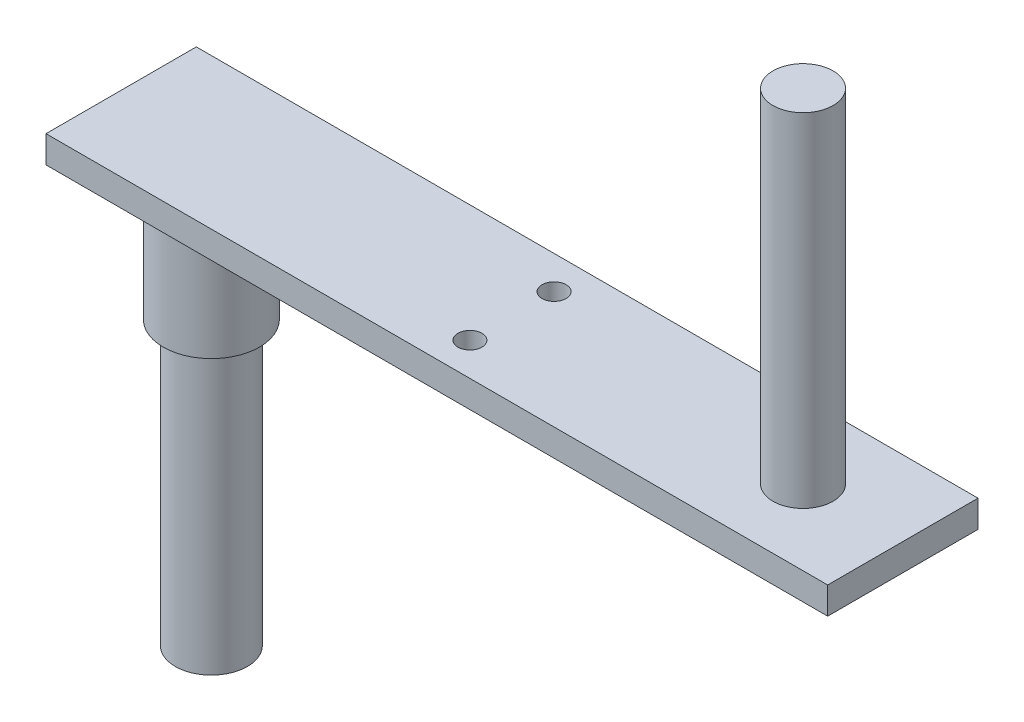
ISO-10303-21;
HEADER;
FILE_DESCRIPTION(('STEP AP214'),'2;1');
FILE_NAME('part.step','',(''),(''),'','','');
FILE_SCHEMA(('AUTOMOTIVE_DESIGN { 1 0 10303 214 1 1 1 1 }'));
ENDSEC;
DATA;
#1=APPLICATION_CONTEXT('core data for automotive mechanical design processes');
#2=APPLICATION_PROTOCOL_DEFINITION('international standard','automotive_design',2000,#1);
#3=PRODUCT_CONTEXT('',#1,'mechanical');
#4=PRODUCT('Part','Part','',(#3));
#5=PRODUCT_RELATED_PRODUCT_CATEGORY('part','',(#4));
#6=PRODUCT_DEFINITION_FORMATION('','',#4);
#7=PRODUCT_DEFINITION_CONTEXT('part definition',#1,'design');
#8=PRODUCT_DEFINITION('design','',#6,#7);
#9=PRODUCT_DEFINITION_SHAPE('','',#8);
#10=(LENGTH_UNIT() NAMED_UNIT(*) SI_UNIT(.MILLI.,.METRE.));
#11=(NAMED_UNIT(*) PLANE_ANGLE_UNIT() SI_UNIT($,.RADIAN.));
#12=(NAMED_UNIT(*) SI_UNIT($,.STERADIAN.) SOLID_ANGLE_UNIT());
#13=UNCERTAINTY_MEASURE_WITH_UNIT(LENGTH_MEASURE(1.E-05),#10,'distance_accuracy_value','');
#14=(GEOMETRIC_REPRESENTATION_CONTEXT(3) GLOBAL_UNCERTAINTY_ASSIGNED_CONTEXT((#13)) GLOBAL_UNIT_ASSIGNED_CONTEXT((#10,
#11,#12)) REPRESENTATION_CONTEXT('',''));
#15=CARTESIAN_POINT('',(0.,0.,0.));
#16=DIRECTION('',(0.,0.,1.));
#17=DIRECTION('',(1.,0.,0.));
#18=AXIS2_PLACEMENT_3D('',#15,#16,#17);
#19=CARTESIAN_POINT('',(65.,4.49999999999995,12.5));
#20=DIRECTION('',(-1.,0.,0.));
#21=DIRECTION('',(0.,0.,0.999999999999999));
#22=AXIS2_PLACEMENT_3D('',#19,#20,#21);
#23=PLANE('',#22);
#24=DIRECTION('',(0.,0.,-0.999999999999999));
#25=VECTOR('',#24,1.);
#26=CARTESIAN_POINT('',(65.,0.,12.5));
#27=LINE('',#26,#25);
#28=CARTESIAN_POINT('',(65.,0.,12.5));
#29=VERTEX_POINT('',#28);
#30=CARTESIAN_POINT('',(65.,0.,-12.5));
#31=VERTEX_POINT('',#30);
#32=EDGE_CURVE('E114',#29,#31,#27,.T.);
#33=ORIENTED_EDGE('',*,*,#32,.T.);
#34=DIRECTION('',(0.,-0.999999999999999,0.));
#35=VECTOR('',#34,1.);
#36=CARTESIAN_POINT('',(65.,4.49999999999995,-12.5));
#37=LINE('',#36,#35);
#38=CARTESIAN_POINT('',(65.,4.49999999999995,-12.5));
#39=VERTEX_POINT('',#38);
#40=EDGE_CURVE('E56',#39,#31,#37,.T.);
#41=ORIENTED_EDGE('',*,*,#40,.F.);
#42=DIRECTION('',(0.,0.,-0.999999999999999));
#43=VECTOR('',#42,1.);
#44=CARTESIAN_POINT('',(65.,4.49999999999995,12.5));
#45=LINE('',#44,#43);
#46=CARTESIAN_POINT('',(65.,4.49999999999995,12.5));
#47=VERTEX_POINT('',#46);
#48=EDGE_CURVE('E100',#47,#39,#45,.T.);
#49=ORIENTED_EDGE('',*,*,#48,.F.);
#50=DIRECTION('',(0.,-0.999999999999999,0.));
#51=VECTOR('',#50,1.);
#52=CARTESIAN_POINT('',(65.,4.49999999999995,12.5));
#53=LINE('',#52,#51);
#54=EDGE_CURVE('E110',#47,#29,#53,.T.);
#55=ORIENTED_EDGE('',*,*,#54,.T.);
#56=EDGE_LOOP('',(#33,#41,#49,#55));
#57=FACE_BOUND('',#56,.T.);
#58=ADVANCED_FACE('F48',(#57),#23,.F.);
#59=CARTESIAN_POINT('',(-65.,4.50000000000006,-12.5));
#60=DIRECTION('',(0.,0.,0.999999999999999));
#61=DIRECTION('',(1.,0.,0.));
#62=AXIS2_PLACEMENT_3D('',#59,#60,#61);
#63=PLANE('',#62);
#64=DIRECTION('',(-1.,0.,0.));
#65=VECTOR('',#64,1.);
#66=CARTESIAN_POINT('',(-65.,0.,-12.5));
#67=LINE('',#66,#65);
#68=CARTESIAN_POINT('',(-65.,0.,-12.5));
#69=VERTEX_POINT('',#68);
#70=EDGE_CURVE('E105',#31,#69,#67,.T.);
#71=ORIENTED_EDGE('',*,*,#70,.T.);
#72=DIRECTION('',(0.,-0.999999999999999,0.));
#73=VECTOR('',#72,1.);
#74=CARTESIAN_POINT('',(-65.,4.50000000000006,-12.5));
#75=LINE('',#74,#73);
#76=CARTESIAN_POINT('',(-65.,4.50000000000006,-12.5));
#77=VERTEX_POINT('',#76);
#78=EDGE_CURVE('E103',#77,#69,#75,.T.);
#79=ORIENTED_EDGE('',*,*,#78,.F.);
#80=DIRECTION('',(-1.,0.,0.));
#81=VECTOR('',#80,1.);
#82=CARTESIAN_POINT('',(-65.,4.50000000000006,-12.5));
#83=LINE('',#82,#81);
#84=EDGE_CURVE('E95',#39,#77,#83,.T.);
#85=ORIENTED_EDGE('',*,*,#84,.F.);
#86=ORIENTED_EDGE('',*,*,#40,.T.);
#87=EDGE_LOOP('',(#71,#79,#85,#86));
#88=FACE_BOUND('',#87,.T.);
#89=ADVANCED_FACE('F104',(#88),#63,.F.);
#90=CARTESIAN_POINT('',(-65.,4.50000000000006,12.5));
#91=DIRECTION('',(1.,0.,0.));
#92=DIRECTION('',(0.,0.,-0.999999999999999));
#93=AXIS2_PLACEMENT_3D('',#90,#91,#92);
#94=PLANE('',#93);
#95=DIRECTION('',(0.,0.,0.999999999999999));
#96=VECTOR('',#95,1.);
#97=CARTESIAN_POINT('',(-65.,0.,12.5));
#98=LINE('',#97,#96);
#99=CARTESIAN_POINT('',(-65.,0.,12.5));
#100=VERTEX_POINT('',#99);
#101=EDGE_CURVE('E81',#69,#100,#98,.T.);
#102=ORIENTED_EDGE('',*,*,#101,.T.);
#103=DIRECTION('',(0.,-0.999999999999999,0.));
#104=VECTOR('',#103,1.);
#105=CARTESIAN_POINT('',(-65.,4.50000000000006,12.5));
#106=LINE('',#105,#104);
#107=CARTESIAN_POINT('',(-65.,4.50000000000006,12.5));
#108=VERTEX_POINT('',#107);
#109=EDGE_CURVE('E106',#108,#100,#106,.T.);
#110=ORIENTED_EDGE('',*,*,#109,.F.);
#111=DIRECTION('',(0.,0.,0.999999999999999));
#112=VECTOR('',#111,1.);
#113=CARTESIAN_POINT('',(-65.,4.50000000000006,12.5));
#114=LINE('',#113,#112);
#115=EDGE_CURVE('E98',#77,#108,#114,.T.);
#116=ORIENTED_EDGE('',*,*,#115,.F.);
#117=ORIENTED_EDGE('',*,*,#78,.T.);
#118=EDGE_LOOP('',(#102,#110,#116,#117));
#119=FACE_BOUND('',#118,.T.);
#120=ADVANCED_FACE('F108',(#119),#94,.F.);
#121=CARTESIAN_POINT('',(-65.,4.50000000000006,12.5));
#122=DIRECTION('',(0.,0.,-0.999999999999999));
#123=DIRECTION('',(-1.,0.,0.));
#124=AXIS2_PLACEMENT_3D('',#121,#122,#123);
#125=PLANE('',#124);
#126=DIRECTION('',(1.,0.,0.));
#127=VECTOR('',#126,1.);
#128=CARTESIAN_POINT('',(-65.,0.,12.5));
#129=LINE('',#128,#127);
#130=EDGE_CURVE('E87',#100,#29,#129,.T.);
#131=ORIENTED_EDGE('',*,*,#130,.T.);
#132=ORIENTED_EDGE('',*,*,#54,.F.);
#133=DIRECTION('',(1.,0.,0.));
#134=VECTOR('',#133,1.);
#135=CARTESIAN_POINT('',(-65.,4.50000000000006,12.5));
#136=LINE('',#135,#134);
#137=EDGE_CURVE('E64',#108,#47,#136,.T.);
#138=ORIENTED_EDGE('',*,*,#137,.F.);
#139=ORIENTED_EDGE('',*,*,#109,.T.);
#140=EDGE_LOOP('',(#131,#132,#138,#139));
#141=FACE_BOUND('',#140,.T.);
#142=ADVANCED_FACE('F137',(#141),#125,.F.);
#143=CARTESIAN_POINT('',(0.,4.49999999999995,0.));
#144=DIRECTION('',(0.,-0.999999999999999,0.));
#145=DIRECTION('',(0.,0.,-0.999999999999999));
#146=AXIS2_PLACEMENT_3D('',#143,#144,#145);
#147=PLANE('',#146);
#148=CARTESIAN_POINT('',(0.,4.49999999999995,-6.99999999999996));
#149=DIRECTION('',(0.,-0.999999999999999,0.));
#150=DIRECTION('',(0.,0.,-0.999999999999999));
#151=AXIS2_PLACEMENT_3D('',#148,#149,#150);
#152=CIRCLE('',#151,2.);
#153=CARTESIAN_POINT('',(0.,4.49999999999996,-8.99999999999998));
#154=VERTEX_POINT('',#153);
#155=EDGE_CURVE('E228',#154,#154,#152,.F.);
#156=ORIENTED_EDGE('',*,*,#155,.F.);
#157=EDGE_LOOP('',(#156));
#158=FACE_BOUND('',#157,.T.);
#159=CARTESIAN_POINT('',(0.,4.49999999999995,6.99999999999999));
#160=DIRECTION('',(0.,-0.999999999999999,0.));
#161=DIRECTION('',(0.,0.,-0.999999999999999));
#162=AXIS2_PLACEMENT_3D('',#159,#160,#161);
#163=CIRCLE('',#162,2.);
#164=CARTESIAN_POINT('',(0.,4.49999999999996,4.99999999999999));
#165=VERTEX_POINT('',#164);
#166=EDGE_CURVE('E232',#165,#165,#163,.F.);
#167=ORIENTED_EDGE('',*,*,#166,.F.);
#168=EDGE_LOOP('',(#167));
#169=FACE_BOUND('',#168,.T.);
#170=CARTESIAN_POINT('',(48.4000000000001,4.49999999999995,0.));
#171=DIRECTION('',(0.,-0.999999999999999,0.));
#172=DIRECTION('',(0.,0.,-0.999999999999999));
#173=AXIS2_PLACEMENT_3D('',#170,#171,#172);
#174=CIRCLE('',#173,5.);
#175=CARTESIAN_POINT('',(48.4000000000001,4.49999999999995,-4.99999999999998));
#176=VERTEX_POINT('',#175);
#177=EDGE_CURVE('E13',#176,#176,#174,.F.);
#178=ORIENTED_EDGE('',*,*,#177,.F.);
#179=EDGE_LOOP('',(#178));
#180=FACE_BOUND('',#179,.T.);
#181=ORIENTED_EDGE('',*,*,#48,.T.);
#182=ORIENTED_EDGE('',*,*,#84,.T.);
#183=ORIENTED_EDGE('',*,*,#115,.T.);
#184=ORIENTED_EDGE('',*,*,#137,.T.);
#185=EDGE_LOOP('',(#181,#182,#183,#184));
#186=FACE_BOUND('',#185,.T.);
#187=ADVANCED_FACE('F96',(#158,#169,#180,#186),#147,.F.);
#188=CARTESIAN_POINT('',(0.,0.,0.));
#189=DIRECTION('',(0.,-0.999999999999999,0.));
#190=DIRECTION('',(0.,0.,-0.999999999999999));
#191=AXIS2_PLACEMENT_3D('',#188,#189,#190);
#192=PLANE('',#191);
#193=CARTESIAN_POINT('',(0.,0.,-6.99999999999996));
#194=DIRECTION('',(0.,-0.999999999999999,0.));
#195=DIRECTION('',(0.,0.,-0.999999999999999));
#196=AXIS2_PLACEMENT_3D('',#193,#194,#195);
#197=CIRCLE('',#196,2.);
#198=CARTESIAN_POINT('',(0.,0.,-8.99999999999998));
#199=VERTEX_POINT('',#198);
#200=EDGE_CURVE('E225',#199,#199,#197,.T.);
#201=ORIENTED_EDGE('',*,*,#200,.F.);
#202=EDGE_LOOP('',(#201));
#203=FACE_BOUND('',#202,.T.);
#204=CARTESIAN_POINT('',(0.,0.,6.99999999999999));
#205=DIRECTION('',(0.,-0.999999999999999,0.));
#206=DIRECTION('',(0.,0.,-0.999999999999999));
#207=AXIS2_PLACEMENT_3D('',#204,#205,#206);
#208=CIRCLE('',#207,2.);
#209=CARTESIAN_POINT('',(0.,0.,4.99999999999999));
#210=VERTEX_POINT('',#209);
#211=EDGE_CURVE('E229',#210,#210,#208,.T.);
#212=ORIENTED_EDGE('',*,*,#211,.F.);
#213=EDGE_LOOP('',(#212));
#214=FACE_BOUND('',#213,.T.);
#215=CARTESIAN_POINT('',(-50.,0.,0.));
#216=DIRECTION('',(0.,-0.999999999999999,0.));
#217=DIRECTION('',(0.,0.,-0.999999999999999));
#218=AXIS2_PLACEMENT_3D('',#215,#216,#217);
#219=CIRCLE('',#218,8.);
#220=CARTESIAN_POINT('',(-50.,0.,8.00000000000002));
#221=VERTEX_POINT('',#220);
#222=EDGE_CURVE('E242',#221,#221,#219,.T.);
#223=ORIENTED_EDGE('',*,*,#222,.F.);
#224=EDGE_LOOP('',(#223));
#225=FACE_BOUND('',#224,.T.);
#226=ORIENTED_EDGE('',*,*,#32,.F.);
#227=ORIENTED_EDGE('',*,*,#130,.F.);
#228=ORIENTED_EDGE('',*,*,#101,.F.);
#229=ORIENTED_EDGE('',*,*,#70,.F.);
#230=EDGE_LOOP('',(#226,#227,#228,#229));
#231=FACE_BOUND('',#230,.T.);
#232=ADVANCED_FACE('F125',(#203,#214,#225,#231),#192,.T.);
#233=CARTESIAN_POINT('',(48.4000000000001,61.5,0.));
#234=DIRECTION('',(0.,-0.999999999999999,0.));
#235=DIRECTION('',(0.,0.,-0.999999999999999));
#236=AXIS2_PLACEMENT_3D('',#233,#234,#235);
#237=CYLINDRICAL_SURFACE('',#236,5.);
#238=CARTESIAN_POINT('',(48.4000000000001,61.5,0.));
#239=DIRECTION('',(0.,0.999999999999999,0.));
#240=DIRECTION('',(0.,0.,0.999999999999999));
#241=AXIS2_PLACEMENT_3D('',#238,#239,#240);
#242=CIRCLE('',#241,5.);
#243=CARTESIAN_POINT('',(48.4000000000001,61.5,-4.99999999999998));
#244=VERTEX_POINT('',#243);
#245=EDGE_CURVE('E117',#244,#244,#242,.T.);
#246=CARTESIAN_POINT('',(48.4000000000001,61.5,-4.99999999999998));
#247=CARTESIAN_POINT('',(48.4000000000001,60.90625,-4.99999999999998));
#248=CARTESIAN_POINT('',(48.4000000000001,60.3125,-4.99999999999998));
#249=CARTESIAN_POINT('',(48.4000000000001,59.125,-4.99999999999998));
#250=CARTESIAN_POINT('',(48.4000000000001,58.53125,-4.99999999999998));
#251=CARTESIAN_POINT('',(48.4000000000001,57.34375,-4.99999999999998));
#252=CARTESIAN_POINT('',(48.4000000000001,56.75,-4.99999999999998));
#253=CARTESIAN_POINT('',(48.4000000000001,55.5625,-4.99999999999998));
#254=CARTESIAN_POINT('',(48.4000000000001,54.96875,-4.99999999999998));
#255=CARTESIAN_POINT('',(48.4000000000001,53.78125,-4.99999999999998));
#256=CARTESIAN_POINT('',(48.4000000000001,53.1875,-4.99999999999998));
#257=CARTESIAN_POINT('',(48.4000000000001,52.,-4.99999999999998));
#258=CARTESIAN_POINT('',(48.4000000000001,51.40625,-4.99999999999998));
#259=CARTESIAN_POINT('',(48.4000000000001,50.21875,-4.99999999999998));
#260=CARTESIAN_POINT('',(48.4000000000001,49.625,-4.99999999999998));
#261=CARTESIAN_POINT('',(48.4000000000001,48.4375,-4.99999999999998));
#262=CARTESIAN_POINT('',(48.4000000000001,47.84375,-4.99999999999998));
#263=CARTESIAN_POINT('',(48.4000000000001,46.65625,-4.99999999999998));
#264=CARTESIAN_POINT('',(48.4000000000001,46.0625,-4.99999999999998));
#265=CARTESIAN_POINT('',(48.4000000000001,44.875,-4.99999999999998));
#266=CARTESIAN_POINT('',(48.4000000000001,44.28125,-4.99999999999998));
#267=CARTESIAN_POINT('',(48.4000000000001,43.09375,-4.99999999999998));
#268=CARTESIAN_POINT('',(48.4000000000001,42.5,-4.99999999999998));
#269=CARTESIAN_POINT('',(48.4000000000001,41.3125,-4.99999999999998));
#270=CARTESIAN_POINT('',(48.4000000000001,40.71875,-4.99999999999998));
#271=CARTESIAN_POINT('',(48.4000000000001,39.53125,-4.99999999999998));
#272=CARTESIAN_POINT('',(48.4000000000001,38.9375,-4.99999999999998));
#273=CARTESIAN_POINT('',(48.4000000000001,37.75,-4.99999999999998));
#274=CARTESIAN_POINT('',(48.4000000000001,37.15625,-4.99999999999998));
#275=CARTESIAN_POINT('',(48.4000000000001,35.96875,-4.99999999999998));
#276=CARTESIAN_POINT('',(48.4000000000001,35.375,-4.99999999999998));
#277=CARTESIAN_POINT('',(48.4000000000001,34.1875,-4.99999999999998));
#278=CARTESIAN_POINT('',(48.4000000000001,33.59375,-4.99999999999998));
#279=CARTESIAN_POINT('',(48.4000000000001,32.40625,-4.99999999999998));
#280=CARTESIAN_POINT('',(48.4000000000001,31.8125,-4.99999999999998));
#281=CARTESIAN_POINT('',(48.4000000000001,30.625,-4.99999999999998));
#282=CARTESIAN_POINT('',(48.4000000000001,30.03125,-4.99999999999998));
#283=CARTESIAN_POINT('',(48.4000000000001,28.84375,-4.99999999999998));
#284=CARTESIAN_POINT('',(48.4000000000001,28.25,-4.99999999999998));
#285=CARTESIAN_POINT('',(48.4000000000001,27.0625,-4.99999999999998));
#286=CARTESIAN_POINT('',(48.4000000000001,26.46875,-4.99999999999998));
#287=CARTESIAN_POINT('',(48.4000000000001,25.28125,-4.99999999999998));
#288=CARTESIAN_POINT('',(48.4000000000001,24.6875,-4.99999999999998));
#289=CARTESIAN_POINT('',(48.4000000000001,23.5,-4.99999999999998));
#290=CARTESIAN_POINT('',(48.4000000000001,22.90625,-4.99999999999998));
#291=CARTESIAN_POINT('',(48.4000000000001,21.71875,-4.99999999999998));
#292=CARTESIAN_POINT('',(48.4000000000001,21.125,-4.99999999999998));
#293=CARTESIAN_POINT('',(48.4000000000001,19.9375,-4.99999999999998));
#294=CARTESIAN_POINT('',(48.4000000000001,19.34375,-4.99999999999998));
#295=CARTESIAN_POINT('',(48.4000000000001,18.15625,-4.99999999999998));
#296=CARTESIAN_POINT('',(48.4000000000001,17.5625,-4.99999999999998));
#297=CARTESIAN_POINT('',(48.4000000000001,16.375,-4.99999999999998));
#298=CARTESIAN_POINT('',(48.4000000000001,15.78125,-4.99999999999998));
#299=CARTESIAN_POINT('',(48.4000000000001,14.59375,-4.99999999999998));
#300=CARTESIAN_POINT('',(48.4000000000001,14.,-4.99999999999998));
#301=CARTESIAN_POINT('',(48.4000000000001,12.8125,-4.99999999999998));
#302=CARTESIAN_POINT('',(48.4000000000001,12.21875,-4.99999999999998));
#303=CARTESIAN_POINT('',(48.4000000000001,11.03125,-4.99999999999998));
#304=CARTESIAN_POINT('',(48.4000000000001,10.4375,-4.99999999999998));
#305=CARTESIAN_POINT('',(48.4000000000001,9.24999999999995,-4.99999999999998));
#306=CARTESIAN_POINT('',(48.4000000000001,8.65624999999996,-4.99999999999998));
#307=CARTESIAN_POINT('',(48.4000000000001,7.46874999999996,-4.99999999999998));
#308=CARTESIAN_POINT('',(48.4000000000001,6.87499999999995,-4.99999999999998));
#309=CARTESIAN_POINT('',(48.4000000000001,5.68749999999995,-4.99999999999998));
#310=CARTESIAN_POINT('',(48.4000000000001,5.09374999999995,-4.99999999999998));
#311=CARTESIAN_POINT('',(48.4000000000001,4.49999999999995,-4.99999999999998));
#312=B_SPLINE_CURVE_WITH_KNOTS('',3,(#246,#247,#248,#249,#250,#251,#252,#253,#254,#255,#256,
#257,#258,#259,#260,#261,#262,#263,#264,#265,#266,#267,#268,#269,#270,#271,#272,#273,#274,#275,
#276,#277,#278,#279,#280,#281,#282,#283,#284,#285,#286,#287,#288,#289,#290,#291,#292,#293,#294,
#295,#296,#297,#298,#299,#300,#301,#302,#303,#304,#305,#306,#307,#308,#309,#310,#311),
.UNSPECIFIED.,.F.,.F.,(4,2,2,2,2,2,2,2,2,2,2,2,2,2,2,2,2,2,2,2,2,2,2,2,2,2,2,2,2,2,2,2,4),(0.,
1.78125000000001,3.56250000000001,5.34375000000001,7.12500000000001,8.90625000000001,10.6875,
12.46875,14.25,16.03125,17.8125,19.59375,21.375,23.15625,24.9375,26.71875,28.5,30.28125,32.0625,
33.84375,35.625,37.40625,39.1875,40.96875,42.75,44.53125,46.3125,48.09375,49.875,
51.6562500000001,53.4375,55.21875,57.0000000000001),.UNSPECIFIED.);
#313=EDGE_CURVE('BSEAM127',#244,#176,#312,.T.);
#314=ORIENTED_EDGE('',*,*,#245,.F.);
#315=ORIENTED_EDGE('',*,*,#177,.T.);
#316=ORIENTED_EDGE('',*,*,#313,.T.);
#317=ORIENTED_EDGE('',*,*,#313,.F.);
#318=EDGE_LOOP('',(#314,#316,#315,#317));
#319=FACE_BOUND('',#318,.T.);
#320=ADVANCED_FACE('F127',(#319),#237,.T.);
#321=CARTESIAN_POINT('',(48.4000000000001,61.5,0.));
#322=DIRECTION('',(0.,0.999999999999999,0.));
#323=DIRECTION('',(0.,0.,0.999999999999999));
#324=AXIS2_PLACEMENT_3D('',#321,#322,#323);
#325=PLANE('',#324);
#326=ORIENTED_EDGE('',*,*,#245,.T.);
#327=EDGE_LOOP('',(#326));
#328=FACE_BOUND('',#327,.T.);
#329=ADVANCED_FACE('F134',(#328),#325,.T.);
#330=CARTESIAN_POINT('',(-50.,-21.,0.));
#331=DIRECTION('',(0.,0.999999999999999,0.));
#332=DIRECTION('',(0.,0.,0.999999999999999));
#333=AXIS2_PLACEMENT_3D('',#330,#331,#332);
#334=CYLINDRICAL_SURFACE('',#333,8.);
#335=CARTESIAN_POINT('',(-50.,-21.,0.));
#336=DIRECTION('',(0.,-0.999999999999999,0.));
#337=DIRECTION('',(0.,0.,-0.999999999999999));
#338=AXIS2_PLACEMENT_3D('',#335,#336,#337);
#339=CIRCLE('',#338,8.);
#340=CARTESIAN_POINT('',(-50.,-21.,8.00000000000002));
#341=VERTEX_POINT('',#340);
#342=EDGE_CURVE('E245',#341,#341,#339,.T.);
#343=CARTESIAN_POINT('',(-50.,-21.,8.00000000000002));
#344=CARTESIAN_POINT('',(-50.,-20.78125,8.00000000000002));
#345=CARTESIAN_POINT('',(-50.,-20.5625,8.00000000000002));
#346=CARTESIAN_POINT('',(-50.,-20.125,8.00000000000002));
#347=CARTESIAN_POINT('',(-50.,-19.90625,8.00000000000002));
#348=CARTESIAN_POINT('',(-50.,-19.46875,8.00000000000002));
#349=CARTESIAN_POINT('',(-50.,-19.25,8.00000000000002));
#350=CARTESIAN_POINT('',(-50.,-18.8125,8.00000000000002));
#351=CARTESIAN_POINT('',(-50.,-18.59375,8.00000000000002));
#352=CARTESIAN_POINT('',(-50.,-18.15625,8.00000000000002));
#353=CARTESIAN_POINT('',(-50.,-17.9375,8.00000000000002));
#354=CARTESIAN_POINT('',(-50.,-17.5,8.00000000000002));
#355=CARTESIAN_POINT('',(-50.,-17.28125,8.00000000000002));
#356=CARTESIAN_POINT('',(-50.,-16.84375,8.00000000000002));
#357=CARTESIAN_POINT('',(-50.,-16.625,8.00000000000002));
#358=CARTESIAN_POINT('',(-50.,-16.1875,8.00000000000002));
#359=CARTESIAN_POINT('',(-50.,-15.96875,8.00000000000002));
#360=CARTESIAN_POINT('',(-50.,-15.53125,8.00000000000002));
#361=CARTESIAN_POINT('',(-50.,-15.3125,8.00000000000002));
#362=CARTESIAN_POINT('',(-50.,-14.875,8.00000000000002));
#363=CARTESIAN_POINT('',(-50.,-14.65625,8.00000000000002));
#364=CARTESIAN_POINT('',(-50.,-14.21875,8.00000000000002));
#365=CARTESIAN_POINT('',(-50.,-14.,8.00000000000002));
#366=CARTESIAN_POINT('',(-50.,-13.5625,8.00000000000002));
#367=CARTESIAN_POINT('',(-50.,-13.34375,8.00000000000002));
#368=CARTESIAN_POINT('',(-50.,-12.90625,8.00000000000002));
#369=CARTESIAN_POINT('',(-50.,-12.6875,8.00000000000002));
#370=CARTESIAN_POINT('',(-50.,-12.25,8.00000000000002));
#371=CARTESIAN_POINT('',(-50.,-12.03125,8.00000000000002));
#372=CARTESIAN_POINT('',(-50.,-11.59375,8.00000000000002));
#373=CARTESIAN_POINT('',(-50.,-11.375,8.00000000000002));
#374=CARTESIAN_POINT('',(-50.,-10.9375,8.00000000000002));
#375=CARTESIAN_POINT('',(-50.,-10.71875,8.00000000000002));
#376=CARTESIAN_POINT('',(-50.,-10.28125,8.00000000000002));
#377=CARTESIAN_POINT('',(-50.,-10.0625,8.00000000000002));
#378=CARTESIAN_POINT('',(-50.,-9.62500000000001,8.00000000000002));
#379=CARTESIAN_POINT('',(-50.,-9.40625000000001,8.00000000000002));
#380=CARTESIAN_POINT('',(-50.,-8.96875000000001,8.00000000000002));
#381=CARTESIAN_POINT('',(-50.,-8.75000000000001,8.00000000000002));
#382=CARTESIAN_POINT('',(-50.,-8.31250000000001,8.00000000000002));
#383=CARTESIAN_POINT('',(-50.,-8.09375000000001,8.00000000000002));
#384=CARTESIAN_POINT('',(-50.,-7.65625000000001,8.00000000000002));
#385=CARTESIAN_POINT('',(-50.,-7.43750000000001,8.00000000000002));
#386=CARTESIAN_POINT('',(-50.,-7.00000000000001,8.00000000000002));
#387=CARTESIAN_POINT('',(-50.,-6.78125000000001,8.00000000000002));
#388=CARTESIAN_POINT('',(-50.,-6.34375000000001,8.00000000000002));
#389=CARTESIAN_POINT('',(-50.,-6.12500000000001,8.00000000000002));
#390=CARTESIAN_POINT('',(-50.,-5.68750000000001,8.00000000000002));
#391=CARTESIAN_POINT('',(-50.,-5.46875000000001,8.00000000000002));
#392=CARTESIAN_POINT('',(-50.,-5.03125000000001,8.00000000000002));
#393=CARTESIAN_POINT('',(-50.,-4.81250000000001,8.00000000000002));
#394=CARTESIAN_POINT('',(-50.,-4.375,8.00000000000002));
#395=CARTESIAN_POINT('',(-50.,-4.15625,8.00000000000002));
#396=CARTESIAN_POINT('',(-50.,-3.71875,8.00000000000002));
#397=CARTESIAN_POINT('',(-50.,-3.5,8.00000000000002));
#398=CARTESIAN_POINT('',(-50.,-3.0625,8.00000000000002));
#399=CARTESIAN_POINT('',(-50.,-2.84375,8.00000000000002));
#400=CARTESIAN_POINT('',(-50.,-2.40625,8.00000000000002));
#401=CARTESIAN_POINT('',(-50.,-2.1875,8.00000000000002));
#402=CARTESIAN_POINT('',(-50.,-1.75,8.00000000000002));
#403=CARTESIAN_POINT('',(-50.,-1.53125,8.00000000000002));
#404=CARTESIAN_POINT('',(-50.,-1.09375,8.00000000000002));
#405=CARTESIAN_POINT('',(-50.,-0.875000000000001,8.00000000000002));
#406=CARTESIAN_POINT('',(-50.,-0.4375,8.00000000000002));
#407=CARTESIAN_POINT('',(-50.,-0.21875,8.00000000000002));
#408=CARTESIAN_POINT('',(-50.,0.,8.00000000000002));
#409=B_SPLINE_CURVE_WITH_KNOTS('',3,(#343,#344,#345,#346,#347,#348,#349,#350,#351,#352,#353,
#354,#355,#356,#357,#358,#359,#360,#361,#362,#363,#364,#365,#366,#367,#368,#369,#370,#371,#372,
#373,#374,#375,#376,#377,#378,#379,#380,#381,#382,#383,#384,#385,#386,#387,#388,#389,#390,#391,
#392,#393,#394,#395,#396,#397,#398,#399,#400,#401,#402,#403,#404,#405,#406,#407,#408),
.UNSPECIFIED.,.F.,.F.,(4,2,2,2,2,2,2,2,2,2,2,2,2,2,2,2,2,2,2,2,2,2,2,2,2,2,2,2,2,2,2,2,4),(0.,
0.656249999999997,1.3125,1.96875,2.625,3.28125,3.9375,4.59375,5.25,5.90625,6.5625,7.21875,7.875,
8.53125000000001,9.18750000000001,9.84375000000001,10.5,11.15625,11.8125,12.46875,13.125,
13.78125,14.4375,15.09375,15.75,16.40625,17.0625,17.71875,18.375,19.03125,19.6875,20.34375,21.),.UNSPECIFIED.);
#410=EDGE_CURVE('BSEAM173',#341,#221,#409,.T.);
#411=ORIENTED_EDGE('',*,*,#342,.F.);
#412=ORIENTED_EDGE('',*,*,#222,.T.);
#413=ORIENTED_EDGE('',*,*,#410,.T.);
#414=ORIENTED_EDGE('',*,*,#410,.F.);
#415=EDGE_LOOP('',(#411,#413,#412,#414));
#416=FACE_BOUND('',#415,.T.);
#417=ADVANCED_FACE('F173',(#416),#334,.T.);
#418=CARTESIAN_POINT('',(-50.,-21.,0.));
#419=DIRECTION('',(0.,-0.999999999999999,0.));
#420=DIRECTION('',(0.,0.,-0.999999999999999));
#421=AXIS2_PLACEMENT_3D('',#418,#419,#420);
#422=PLANE('',#421);
#423=CARTESIAN_POINT('',(-50.,-21.,0.));
#424=DIRECTION('',(0.,-0.999999999999999,0.));
#425=DIRECTION('',(0.,0.,-0.999999999999999));
#426=AXIS2_PLACEMENT_3D('',#423,#424,#425);
#427=CIRCLE('',#426,6.);
#428=CARTESIAN_POINT('',(-50.,-21.,6.00000000000002));
#429=VERTEX_POINT('',#428);
#430=EDGE_CURVE('E238',#429,#429,#427,.T.);
#431=ORIENTED_EDGE('',*,*,#430,.F.);
#432=EDGE_LOOP('',(#431));
#433=FACE_BOUND('',#432,.T.);
#434=ORIENTED_EDGE('',*,*,#342,.T.);
#435=EDGE_LOOP('',(#434));
#436=FACE_BOUND('',#435,.T.);
#437=ADVANCED_FACE('F181',(#433,#436),#422,.T.);
#438=CARTESIAN_POINT('',(-50.,-67.9999999999999,0.));
#439=DIRECTION('',(0.,0.999999999999999,0.));
#440=DIRECTION('',(0.,0.,0.999999999999999));
#441=AXIS2_PLACEMENT_3D('',#438,#439,#440);
#442=CYLINDRICAL_SURFACE('',#441,6.);
#443=CARTESIAN_POINT('',(-50.,-67.9999999999999,0.));
#444=DIRECTION('',(0.,-0.999999999999999,0.));
#445=DIRECTION('',(0.,0.,-0.999999999999999));
#446=AXIS2_PLACEMENT_3D('',#443,#444,#445);
#447=CIRCLE('',#446,6.);
#448=CARTESIAN_POINT('',(-50.,-68.,6.00000000000002));
#449=VERTEX_POINT('',#448);
#450=EDGE_CURVE('E239',#449,#449,#447,.T.);
#451=CARTESIAN_POINT('',(-50.,-68.,6.00000000000002));
#452=CARTESIAN_POINT('',(-50.,-67.5104166666666,6.00000000000002));
#453=CARTESIAN_POINT('',(-50.,-67.0208333333333,6.00000000000002));
#454=CARTESIAN_POINT('',(-50.,-66.0416666666666,6.00000000000002));
#455=CARTESIAN_POINT('',(-50.,-65.5520833333333,6.00000000000002));
#456=CARTESIAN_POINT('',(-50.,-64.5729166666666,6.00000000000002));
#457=CARTESIAN_POINT('',(-50.,-64.0833333333333,6.00000000000002));
#458=CARTESIAN_POINT('',(-50.,-63.1041666666666,6.00000000000002));
#459=CARTESIAN_POINT('',(-50.,-62.6145833333333,6.00000000000002));
#460=CARTESIAN_POINT('',(-50.,-61.6354166666666,6.00000000000002));
#461=CARTESIAN_POINT('',(-50.,-61.1458333333333,6.00000000000002));
#462=CARTESIAN_POINT('',(-50.,-60.1666666666666,6.00000000000002));
#463=CARTESIAN_POINT('',(-50.,-59.6770833333333,6.00000000000002));
#464=CARTESIAN_POINT('',(-50.,-58.6979166666666,6.00000000000002));
#465=CARTESIAN_POINT('',(-50.,-58.2083333333333,6.00000000000002));
#466=CARTESIAN_POINT('',(-50.,-57.2291666666666,6.00000000000002));
#467=CARTESIAN_POINT('',(-50.,-56.7395833333333,6.00000000000002));
#468=CARTESIAN_POINT('',(-50.,-55.7604166666666,6.00000000000002));
#469=CARTESIAN_POINT('',(-50.,-55.2708333333333,6.00000000000002));
#470=CARTESIAN_POINT('',(-50.,-54.2916666666666,6.00000000000002));
#471=CARTESIAN_POINT('',(-50.,-53.8020833333333,6.00000000000002));
#472=CARTESIAN_POINT('',(-50.,-52.8229166666666,6.00000000000002));
#473=CARTESIAN_POINT('',(-50.,-52.3333333333333,6.00000000000002));
#474=CARTESIAN_POINT('',(-50.,-51.3541666666666,6.00000000000002));
#475=CARTESIAN_POINT('',(-50.,-50.8645833333333,6.00000000000002));
#476=CARTESIAN_POINT('',(-50.,-49.8854166666667,6.00000000000002));
#477=CARTESIAN_POINT('',(-50.,-49.3958333333333,6.00000000000002));
#478=CARTESIAN_POINT('',(-50.,-48.4166666666667,6.00000000000002));
#479=CARTESIAN_POINT('',(-50.,-47.9270833333333,6.00000000000002));
#480=CARTESIAN_POINT('',(-50.,-46.9479166666667,6.00000000000002));
#481=CARTESIAN_POINT('',(-50.,-46.4583333333333,6.00000000000002));
#482=CARTESIAN_POINT('',(-50.,-45.4791666666667,6.00000000000002));
#483=CARTESIAN_POINT('',(-50.,-44.9895833333333,6.00000000000002));
#484=CARTESIAN_POINT('',(-50.,-44.0104166666667,6.00000000000002));
#485=CARTESIAN_POINT('',(-50.,-43.5208333333333,6.00000000000002));
#486=CARTESIAN_POINT('',(-50.,-42.5416666666667,6.00000000000002));
#487=CARTESIAN_POINT('',(-50.,-42.0520833333333,6.00000000000002));
#488=CARTESIAN_POINT('',(-50.,-41.0729166666667,6.00000000000002));
#489=CARTESIAN_POINT('',(-50.,-40.5833333333333,6.00000000000002));
#490=CARTESIAN_POINT('',(-50.,-39.6041666666667,6.00000000000002));
#491=CARTESIAN_POINT('',(-50.,-39.1145833333333,6.00000000000002));
#492=CARTESIAN_POINT('',(-50.,-38.1354166666667,6.00000000000002));
#493=CARTESIAN_POINT('',(-50.,-37.6458333333333,6.00000000000002));
#494=CARTESIAN_POINT('',(-50.,-36.6666666666667,6.00000000000002));
#495=CARTESIAN_POINT('',(-50.,-36.1770833333333,6.00000000000002));
#496=CARTESIAN_POINT('',(-50.,-35.1979166666667,6.00000000000002));
#497=CARTESIAN_POINT('',(-50.,-34.7083333333333,6.00000000000002));
#498=CARTESIAN_POINT('',(-50.,-33.7291666666667,6.00000000000002));
#499=CARTESIAN_POINT('',(-50.,-33.2395833333333,6.00000000000002));
#500=CARTESIAN_POINT('',(-50.,-32.2604166666667,6.00000000000002));
#501=CARTESIAN_POINT('',(-50.,-31.7708333333333,6.00000000000002));
#502=CARTESIAN_POINT('',(-50.,-30.7916666666667,6.00000000000002));
#503=CARTESIAN_POINT('',(-50.,-30.3020833333333,6.00000000000002));
#504=CARTESIAN_POINT('',(-50.,-29.3229166666667,6.00000000000002));
#505=CARTESIAN_POINT('',(-50.,-28.8333333333333,6.00000000000002));
#506=CARTESIAN_POINT('',(-50.,-27.8541666666667,6.00000000000002));
#507=CARTESIAN_POINT('',(-50.,-27.3645833333333,6.00000000000002));
#508=CARTESIAN_POINT('',(-50.,-26.3854166666667,6.00000000000002));
#509=CARTESIAN_POINT('',(-50.,-25.8958333333333,6.00000000000002));
#510=CARTESIAN_POINT('',(-50.,-24.9166666666667,6.00000000000002));
#511=CARTESIAN_POINT('',(-50.,-24.4270833333333,6.00000000000002));
#512=CARTESIAN_POINT('',(-50.,-23.4479166666667,6.00000000000002));
#513=CARTESIAN_POINT('',(-50.,-22.9583333333333,6.00000000000002));
#514=CARTESIAN_POINT('',(-50.,-21.9791666666667,6.00000000000002));
#515=CARTESIAN_POINT('',(-50.,-21.4895833333333,6.00000000000002));
#516=CARTESIAN_POINT('',(-50.,-21.,6.00000000000002));
#517=B_SPLINE_CURVE_WITH_KNOTS('',3,(#451,#452,#453,#454,#455,#456,#457,#458,#459,#460,#461,
#462,#463,#464,#465,#466,#467,#468,#469,#470,#471,#472,#473,#474,#475,#476,#477,#478,#479,#480,
#481,#482,#483,#484,#485,#486,#487,#488,#489,#490,#491,#492,#493,#494,#495,#496,#497,#498,#499,
#500,#501,#502,#503,#504,#505,#506,#507,#508,#509,#510,#511,#512,#513,#514,#515,#516),
.UNSPECIFIED.,.F.,.F.,(4,2,2,2,2,2,2,2,2,2,2,2,2,2,2,2,2,2,2,2,2,2,2,2,2,2,2,2,2,2,2,2,4),(0.,
1.46875,2.93750000000001,4.40625,5.875,7.34375,8.81249999999999,10.28125,11.75,13.21875,14.6875,
16.15625,17.625,19.09375,20.5625,22.03125,23.5,24.96875,26.4375,27.90625,29.375,30.84375,
32.3125,33.78125,35.25,36.71875,38.1875,39.65625,41.125,42.59375,44.0625,45.53125,
46.9999999999999),.UNSPECIFIED.);
#518=EDGE_CURVE('BSEAM189',#449,#429,#517,.T.);
#519=ORIENTED_EDGE('',*,*,#450,.F.);
#520=ORIENTED_EDGE('',*,*,#430,.T.);
#521=ORIENTED_EDGE('',*,*,#518,.T.);
#522=ORIENTED_EDGE('',*,*,#518,.F.);
#523=EDGE_LOOP('',(#519,#521,#520,#522));
#524=FACE_BOUND('',#523,.T.);
#525=ADVANCED_FACE('F189',(#524),#442,.T.);
#526=CARTESIAN_POINT('',(-50.,-67.9999999999999,0.));
#527=DIRECTION('',(0.,-0.999999999999999,0.));
#528=DIRECTION('',(0.,0.,-0.999999999999999));
#529=AXIS2_PLACEMENT_3D('',#526,#527,#528);
#530=PLANE('',#529);
#531=ORIENTED_EDGE('',*,*,#450,.T.);
#532=EDGE_LOOP('',(#531));
#533=FACE_BOUND('',#532,.T.);
#534=ADVANCED_FACE('F197',(#533),#530,.T.);
#535=CARTESIAN_POINT('',(0.,61.501,6.99999999999999));
#536=DIRECTION('',(0.,-0.999999999999999,0.));
#537=DIRECTION('',(0.,0.,-0.999999999999999));
#538=AXIS2_PLACEMENT_3D('',#535,#536,#537);
#539=CYLINDRICAL_SURFACE('',#538,2.);
#540=CARTESIAN_POINT('',(0.,0.,4.99999999999999));
#541=CARTESIAN_POINT('',(0.,0.0468749999999994,4.99999999999999));
#542=CARTESIAN_POINT('',(0.,0.0937499999999989,4.99999999999999));
#543=CARTESIAN_POINT('',(0.,0.187499999999998,4.99999999999999));
#544=CARTESIAN_POINT('',(0.,0.234374999999997,4.99999999999999));
#545=CARTESIAN_POINT('',(0.,0.328124999999996,4.99999999999999));
#546=CARTESIAN_POINT('',(0.,0.374999999999996,4.99999999999999));
#547=CARTESIAN_POINT('',(0.,0.468749999999995,4.99999999999999));
#548=CARTESIAN_POINT('',(0.,0.515624999999994,4.99999999999999));
#549=CARTESIAN_POINT('',(0.,0.609374999999993,4.99999999999999));
#550=CARTESIAN_POINT('',(0.,0.656249999999992,4.99999999999999));
#551=CARTESIAN_POINT('',(0.,0.749999999999991,4.99999999999999));
#552=CARTESIAN_POINT('',(0.,0.796874999999991,4.99999999999999));
#553=CARTESIAN_POINT('',(0.,0.89062499999999,4.99999999999999));
#554=CARTESIAN_POINT('',(0.,0.937499999999989,4.99999999999999));
#555=CARTESIAN_POINT('',(0.,1.03124999999999,4.99999999999999));
#556=CARTESIAN_POINT('',(0.,1.07812499999999,4.99999999999999));
#557=CARTESIAN_POINT('',(0.,1.17187499999999,4.99999999999999));
#558=CARTESIAN_POINT('',(0.,1.21874999999999,4.99999999999999));
#559=CARTESIAN_POINT('',(0.,1.31249999999999,4.99999999999999));
#560=CARTESIAN_POINT('',(0.,1.35937499999999,4.99999999999999));
#561=CARTESIAN_POINT('',(0.,1.45312499999999,4.99999999999999));
#562=CARTESIAN_POINT('',(0.,1.49999999999999,4.99999999999999));
#563=CARTESIAN_POINT('',(0.,1.59374999999999,4.99999999999999));
#564=CARTESIAN_POINT('',(0.,1.64062499999999,4.99999999999999));
#565=CARTESIAN_POINT('',(0.,1.73437499999999,4.99999999999999));
#566=CARTESIAN_POINT('',(0.,1.78124999999999,4.99999999999999));
#567=CARTESIAN_POINT('',(0.,1.87499999999999,4.99999999999999));
#568=CARTESIAN_POINT('',(0.,1.92187499999998,4.99999999999999));
#569=CARTESIAN_POINT('',(0.,2.01562499999998,4.99999999999999));
#570=CARTESIAN_POINT('',(0.,2.06249999999998,4.99999999999999));
#571=CARTESIAN_POINT('',(0.,2.15624999999998,4.99999999999999));
#572=CARTESIAN_POINT('',(0.,2.20312499999998,4.99999999999999));
#573=CARTESIAN_POINT('',(0.,2.29687499999998,4.99999999999999));
#574=CARTESIAN_POINT('',(0.,2.34374999999998,4.99999999999999));
#575=CARTESIAN_POINT('',(0.,2.43749999999998,4.99999999999999));
#576=CARTESIAN_POINT('',(0.,2.48437499999998,4.99999999999999));
#577=CARTESIAN_POINT('',(0.,2.57812499999998,4.99999999999999));
#578=CARTESIAN_POINT('',(0.,2.62499999999998,4.99999999999999));
#579=CARTESIAN_POINT('',(0.,2.71874999999998,4.99999999999999));
#580=CARTESIAN_POINT('',(0.,2.76562499999998,4.99999999999999));
#581=CARTESIAN_POINT('',(0.,2.85937499999997,4.99999999999999));
#582=CARTESIAN_POINT('',(0.,2.90624999999997,4.99999999999999));
#583=CARTESIAN_POINT('',(0.,2.99999999999997,4.99999999999999));
#584=CARTESIAN_POINT('',(0.,3.04687499999996,4.99999999999999));
#585=CARTESIAN_POINT('',(0.,3.14062499999996,4.99999999999999));
#586=CARTESIAN_POINT('',(0.,3.18749999999996,4.99999999999999));
#587=CARTESIAN_POINT('',(0.,3.28124999999996,4.99999999999999));
#588=CARTESIAN_POINT('',(0.,3.32812499999997,4.99999999999999));
#589=CARTESIAN_POINT('',(0.,3.42187499999997,4.99999999999999));
#590=CARTESIAN_POINT('',(0.,3.46874999999997,4.99999999999999));
#591=CARTESIAN_POINT('',(0.,3.56249999999997,4.99999999999999));
#592=CARTESIAN_POINT('',(0.,3.60937499999997,4.99999999999999));
#593=CARTESIAN_POINT('',(0.,3.70312499999996,4.99999999999999));
#594=CARTESIAN_POINT('',(0.,3.74999999999996,4.99999999999999));
#595=CARTESIAN_POINT('',(0.,3.84374999999996,4.99999999999999));
#596=CARTESIAN_POINT('',(0.,3.89062499999996,4.99999999999999));
#597=CARTESIAN_POINT('',(0.,3.98437499999996,4.99999999999999));
#598=CARTESIAN_POINT('',(0.,4.03124999999996,4.99999999999999));
#599=CARTESIAN_POINT('',(0.,4.12499999999996,4.99999999999999));
#600=CARTESIAN_POINT('',(0.,4.17187499999996,4.99999999999999));
#601=CARTESIAN_POINT('',(0.,4.26562499999996,4.99999999999999));
#602=CARTESIAN_POINT('',(0.,4.31249999999996,4.99999999999999));
#603=CARTESIAN_POINT('',(0.,4.40624999999996,4.99999999999999));
#604=CARTESIAN_POINT('',(0.,4.45312499999996,4.99999999999999));
#605=CARTESIAN_POINT('',(0.,4.49999999999996,4.99999999999999));
#606=B_SPLINE_CURVE_WITH_KNOTS('',3,(#540,#541,#542,#543,#544,#545,#546,#547,#548,#549,#550,
#551,#552,#553,#554,#555,#556,#557,#558,#559,#560,#561,#562,#563,#564,#565,#566,#567,#568,#569,
#570,#571,#572,#573,#574,#575,#576,#577,#578,#579,#580,#581,#582,#583,#584,#585,#586,#587,#588,
#589,#590,#591,#592,#593,#594,#595,#596,#597,#598,#599,#600,#601,#602,#603,#604,#605),
.UNSPECIFIED.,.F.,.F.,(4,2,2,2,2,2,2,2,2,2,2,2,2,2,2,2,2,2,2,2,2,2,2,2,2,2,2,2,2,2,2,2,4),(0.,
0.140624999999998,0.281249999999997,0.421874999999995,0.562499999999994,0.703124999999992,
0.84374999999999,0.984374999999989,1.12499999999999,1.26562499999999,1.40624999999999,
1.54687499999999,1.68749999999999,1.82812499999999,1.96874999999998,2.10937499999998,
2.24999999999998,2.39062499999998,2.53124999999998,2.67187499999998,2.81249999999997,
2.95312499999997,3.09374999999996,3.23437499999996,3.37499999999997,3.51562499999997,
3.65624999999996,3.79687499999996,3.93749999999996,4.07812499999996,4.21874999999996,
4.35937499999996,4.49999999999996),.UNSPECIFIED.);
#607=EDGE_CURVE('BSEAM205',#210,#165,#606,.T.);
#608=ORIENTED_EDGE('',*,*,#211,.T.);
#609=ORIENTED_EDGE('',*,*,#166,.T.);
#610=ORIENTED_EDGE('',*,*,#607,.T.);
#611=ORIENTED_EDGE('',*,*,#607,.F.);
#612=EDGE_LOOP('',(#608,#610,#609,#611));
#613=FACE_BOUND('',#612,.T.);
#614=ADVANCED_FACE('F205',(#613),#539,.F.);
#615=CARTESIAN_POINT('',(0.,61.501,-6.99999999999998));
#616=DIRECTION('',(0.,-0.999999999999999,0.));
#617=DIRECTION('',(0.,0.,-0.999999999999999));
#618=AXIS2_PLACEMENT_3D('',#615,#616,#617);
#619=CYLINDRICAL_SURFACE('',#618,2.);
#620=CARTESIAN_POINT('',(0.,0.,-8.99999999999998));
#621=CARTESIAN_POINT('',(0.,0.0468749999999994,-8.99999999999998));
#622=CARTESIAN_POINT('',(0.,0.0937499999999989,-8.99999999999998));
#623=CARTESIAN_POINT('',(0.,0.187499999999998,-8.99999999999998));
#624=CARTESIAN_POINT('',(0.,0.234374999999997,-8.99999999999998));
#625=CARTESIAN_POINT('',(0.,0.328124999999996,-8.99999999999998));
#626=CARTESIAN_POINT('',(0.,0.374999999999996,-8.99999999999998));
#627=CARTESIAN_POINT('',(0.,0.468749999999995,-8.99999999999998));
#628=CARTESIAN_POINT('',(0.,0.515624999999994,-8.99999999999998));
#629=CARTESIAN_POINT('',(0.,0.609374999999993,-8.99999999999998));
#630=CARTESIAN_POINT('',(0.,0.656249999999992,-8.99999999999998));
#631=CARTESIAN_POINT('',(0.,0.749999999999991,-8.99999999999998));
#632=CARTESIAN_POINT('',(0.,0.796874999999991,-8.99999999999998));
#633=CARTESIAN_POINT('',(0.,0.89062499999999,-8.99999999999998));
#634=CARTESIAN_POINT('',(0.,0.937499999999989,-8.99999999999998));
#635=CARTESIAN_POINT('',(0.,1.03124999999999,-8.99999999999998));
#636=CARTESIAN_POINT('',(0.,1.07812499999999,-8.99999999999998));
#637=CARTESIAN_POINT('',(0.,1.17187499999999,-8.99999999999998));
#638=CARTESIAN_POINT('',(0.,1.21874999999999,-8.99999999999998));
#639=CARTESIAN_POINT('',(0.,1.31249999999999,-8.99999999999998));
#640=CARTESIAN_POINT('',(0.,1.35937499999999,-8.99999999999998));
#641=CARTESIAN_POINT('',(0.,1.45312499999999,-8.99999999999998));
#642=CARTESIAN_POINT('',(0.,1.49999999999999,-8.99999999999998));
#643=CARTESIAN_POINT('',(0.,1.59374999999999,-8.99999999999998));
#644=CARTESIAN_POINT('',(0.,1.64062499999999,-8.99999999999998));
#645=CARTESIAN_POINT('',(0.,1.73437499999999,-8.99999999999998));
#646=CARTESIAN_POINT('',(0.,1.78124999999999,-8.99999999999998));
#647=CARTESIAN_POINT('',(0.,1.87499999999999,-8.99999999999998));
#648=CARTESIAN_POINT('',(0.,1.92187499999998,-8.99999999999998));
#649=CARTESIAN_POINT('',(0.,2.01562499999998,-8.99999999999998));
#650=CARTESIAN_POINT('',(0.,2.06249999999998,-8.99999999999998));
#651=CARTESIAN_POINT('',(0.,2.15624999999998,-8.99999999999998));
#652=CARTESIAN_POINT('',(0.,2.20312499999998,-8.99999999999998));
#653=CARTESIAN_POINT('',(0.,2.29687499999998,-8.99999999999998));
#654=CARTESIAN_POINT('',(0.,2.34374999999998,-8.99999999999998));
#655=CARTESIAN_POINT('',(0.,2.43749999999998,-8.99999999999998));
#656=CARTESIAN_POINT('',(0.,2.48437499999998,-8.99999999999998));
#657=CARTESIAN_POINT('',(0.,2.57812499999998,-8.99999999999998));
#658=CARTESIAN_POINT('',(0.,2.62499999999998,-8.99999999999998));
#659=CARTESIAN_POINT('',(0.,2.71874999999998,-8.99999999999998));
#660=CARTESIAN_POINT('',(0.,2.76562499999998,-8.99999999999998));
#661=CARTESIAN_POINT('',(0.,2.85937499999997,-8.99999999999998));
#662=CARTESIAN_POINT('',(0.,2.90624999999997,-8.99999999999998));
#663=CARTESIAN_POINT('',(0.,2.99999999999997,-8.99999999999998));
#664=CARTESIAN_POINT('',(0.,3.04687499999996,-8.99999999999998));
#665=CARTESIAN_POINT('',(0.,3.14062499999996,-8.99999999999998));
#666=CARTESIAN_POINT('',(0.,3.18749999999996,-8.99999999999998));
#667=CARTESIAN_POINT('',(0.,3.28124999999996,-8.99999999999998));
#668=CARTESIAN_POINT('',(0.,3.32812499999997,-8.99999999999998));
#669=CARTESIAN_POINT('',(0.,3.42187499999997,-8.99999999999998));
#670=CARTESIAN_POINT('',(0.,3.46874999999997,-8.99999999999998));
#671=CARTESIAN_POINT('',(0.,3.56249999999997,-8.99999999999998));
#672=CARTESIAN_POINT('',(0.,3.60937499999997,-8.99999999999998));
#673=CARTESIAN_POINT('',(0.,3.70312499999996,-8.99999999999998));
#674=CARTESIAN_POINT('',(0.,3.74999999999996,-8.99999999999998));
#675=CARTESIAN_POINT('',(0.,3.84374999999996,-8.99999999999998));
#676=CARTESIAN_POINT('',(0.,3.89062499999996,-8.99999999999998));
#677=CARTESIAN_POINT('',(0.,3.98437499999996,-8.99999999999998));
#678=CARTESIAN_POINT('',(0.,4.03124999999996,-8.99999999999998));
#679=CARTESIAN_POINT('',(0.,4.12499999999996,-8.99999999999998));
#680=CARTESIAN_POINT('',(0.,4.17187499999996,-8.99999999999998));
#681=CARTESIAN_POINT('',(0.,4.26562499999996,-8.99999999999998));
#682=CARTESIAN_POINT('',(0.,4.31249999999996,-8.99999999999998));
#683=CARTESIAN_POINT('',(0.,4.40624999999996,-8.99999999999998));
#684=CARTESIAN_POINT('',(0.,4.45312499999996,-8.99999999999998));
#685=CARTESIAN_POINT('',(0.,4.49999999999996,-8.99999999999998));
#686=B_SPLINE_CURVE_WITH_KNOTS('',3,(#620,#621,#622,#623,#624,#625,#626,#627,#628,#629,#630,
#631,#632,#633,#634,#635,#636,#637,#638,#639,#640,#641,#642,#643,#644,#645,#646,#647,#648,#649,
#650,#651,#652,#653,#654,#655,#656,#657,#658,#659,#660,#661,#662,#663,#664,#665,#666,#667,#668,
#669,#670,#671,#672,#673,#674,#675,#676,#677,#678,#679,#680,#681,#682,#683,#684,#685),
.UNSPECIFIED.,.F.,.F.,(4,2,2,2,2,2,2,2,2,2,2,2,2,2,2,2,2,2,2,2,2,2,2,2,2,2,2,2,2,2,2,2,4),(0.,
0.140624999999998,0.281249999999997,0.421874999999995,0.562499999999994,0.703124999999992,
0.84374999999999,0.984374999999989,1.12499999999999,1.26562499999999,1.40624999999999,
1.54687499999999,1.68749999999999,1.82812499999999,1.96874999999998,2.10937499999998,
2.24999999999998,2.39062499999998,2.53124999999998,2.67187499999998,2.81249999999997,
2.95312499999997,3.09374999999996,3.23437499999996,3.37499999999997,3.51562499999997,
3.65624999999996,3.79687499999996,3.93749999999996,4.07812499999996,4.21874999999996,
4.35937499999996,4.49999999999996),.UNSPECIFIED.);
#687=EDGE_CURVE('BSEAM213',#199,#154,#686,.T.);
#688=ORIENTED_EDGE('',*,*,#200,.T.);
#689=ORIENTED_EDGE('',*,*,#155,.T.);
#690=ORIENTED_EDGE('',*,*,#687,.T.);
#691=ORIENTED_EDGE('',*,*,#687,.F.);
#692=EDGE_LOOP('',(#688,#690,#689,#691));
#693=FACE_BOUND('',#692,.T.);
#694=ADVANCED_FACE('F213',(#693),#619,.F.);
#695=CLOSED_SHELL('',(#58,#89,#120,#142,#187,#232,#320,#329,#417,#437,#525,#534,#614,#694));
#696=MANIFOLD_SOLID_BREP('B2',#695);
#697=ADVANCED_BREP_SHAPE_REPRESENTATION('',(#18,#696),#14);
#698=SHAPE_DEFINITION_REPRESENTATION(#9,#697);
ENDSEC;
END-ISO-10303-21;
